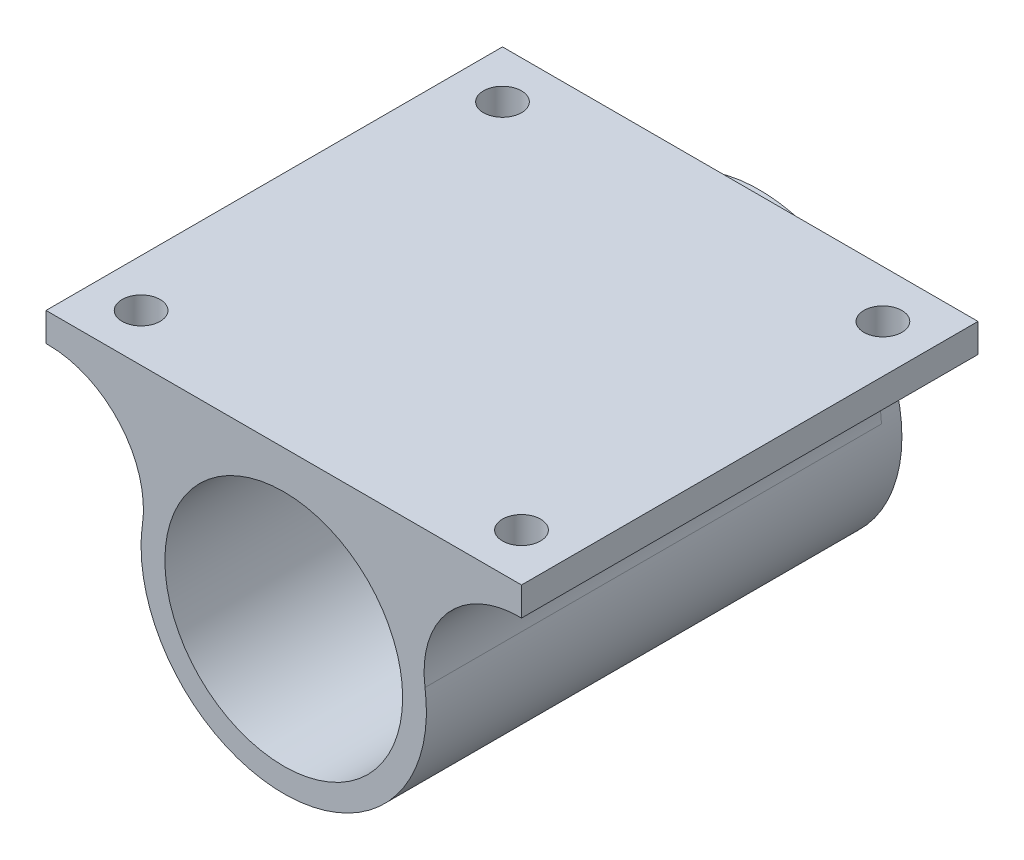
ISO-10303-21;
HEADER;
FILE_DESCRIPTION(('STEP AP214'),'2;1');
FILE_NAME('part.step','',(''),(''),'','','');
FILE_SCHEMA(('AUTOMOTIVE_DESIGN { 1 0 10303 214 1 1 1 1 }'));
ENDSEC;
DATA;
#1=APPLICATION_CONTEXT('core data for automotive mechanical design processes');
#2=APPLICATION_PROTOCOL_DEFINITION('international standard','automotive_design',2000,#1);
#3=PRODUCT_CONTEXT('',#1,'mechanical');
#4=PRODUCT('Part','Part','',(#3));
#5=PRODUCT_RELATED_PRODUCT_CATEGORY('part','',(#4));
#6=PRODUCT_DEFINITION_FORMATION('','',#4);
#7=PRODUCT_DEFINITION_CONTEXT('part definition',#1,'design');
#8=PRODUCT_DEFINITION('design','',#6,#7);
#9=PRODUCT_DEFINITION_SHAPE('','',#8);
#10=(LENGTH_UNIT() NAMED_UNIT(*) SI_UNIT(.MILLI.,.METRE.));
#11=(NAMED_UNIT(*) PLANE_ANGLE_UNIT() SI_UNIT($,.RADIAN.));
#12=(NAMED_UNIT(*) SI_UNIT($,.STERADIAN.) SOLID_ANGLE_UNIT());
#13=UNCERTAINTY_MEASURE_WITH_UNIT(LENGTH_MEASURE(1.E-05),#10,'distance_accuracy_value','');
#14=(GEOMETRIC_REPRESENTATION_CONTEXT(3) GLOBAL_UNCERTAINTY_ASSIGNED_CONTEXT((#13)) GLOBAL_UNIT_ASSIGNED_CONTEXT((#10,
#11,#12)) REPRESENTATION_CONTEXT('',''));
#15=CARTESIAN_POINT('',(0.,0.,0.));
#16=DIRECTION('',(0.,0.,1.));
#17=DIRECTION('',(1.,0.,0.));
#18=AXIS2_PLACEMENT_3D('',#15,#16,#17);
#19=CARTESIAN_POINT('',(-24.7549084540298,3.49206349206349,0.));
#20=DIRECTION('',(0.,0.,1.));
#21=DIRECTION('',(1.,0.,0.));
#22=AXIS2_PLACEMENT_3D('',#19,#20,#21);
#23=PLANE('',#22);
#24=CARTESIAN_POINT('',(0.,0.,0.));
#25=DIRECTION('',(0.,0.,-1.));
#26=DIRECTION('',(-1.,0.,0.));
#27=AXIS2_PLACEMENT_3D('',#24,#25,#26);
#28=CIRCLE('',#27,15.);
#29=CARTESIAN_POINT('',(-14.8529450724179,2.09523809523809,0.));
#30=VERTEX_POINT('',#29);
#31=CARTESIAN_POINT('',(14.8529450724179,2.0952380952381,0.));
#32=VERTEX_POINT('',#31);
#33=EDGE_CURVE('E136',#30,#32,#28,.T.);
#34=ORIENTED_EDGE('',*,*,#33,.F.);
#35=CARTESIAN_POINT('',(-24.7549084540298,3.49206349206349,0.));
#36=DIRECTION('',(0.,0.,-1.));
#37=DIRECTION('',(1.,0.,0.));
#38=AXIS2_PLACEMENT_3D('',#35,#36,#37);
#39=CIRCLE('',#38,10.);
#40=CARTESIAN_POINT('',(-24.7549084540298,13.4920634920635,0.));
#41=VERTEX_POINT('',#40);
#42=EDGE_CURVE('E163',#41,#30,#39,.T.);
#43=ORIENTED_EDGE('',*,*,#42,.F.);
#44=DIRECTION('',(1.,0.,0.));
#45=VECTOR('',#44,1.);
#46=CARTESIAN_POINT('',(-25.,13.4920634920635,0.));
#47=LINE('',#46,#45);
#48=CARTESIAN_POINT('',(-25.,13.4920634920635,0.));
#49=VERTEX_POINT('',#48);
#50=EDGE_CURVE('E160',#49,#41,#47,.T.);
#51=ORIENTED_EDGE('',*,*,#50,.F.);
#52=DIRECTION('',(0.,-1.,0.));
#53=VECTOR('',#52,1.);
#54=CARTESIAN_POINT('',(-25.,13.4920634920635,0.));
#55=LINE('',#54,#53);
#56=CARTESIAN_POINT('',(-25.,16.5079365079365,0.));
#57=VERTEX_POINT('',#56);
#58=EDGE_CURVE('E157',#57,#49,#55,.T.);
#59=ORIENTED_EDGE('',*,*,#58,.F.);
#60=DIRECTION('',(-1.,0.,0.));
#61=VECTOR('',#60,1.);
#62=CARTESIAN_POINT('',(-25.,16.5079365079365,0.));
#63=LINE('',#62,#61);
#64=CARTESIAN_POINT('',(25.,16.5079365079365,0.));
#65=VERTEX_POINT('',#64);
#66=EDGE_CURVE('E153',#65,#57,#63,.T.);
#67=ORIENTED_EDGE('',*,*,#66,.F.);
#68=DIRECTION('',(0.,1.,0.));
#69=VECTOR('',#68,1.);
#70=CARTESIAN_POINT('',(25.,13.4920634920635,0.));
#71=LINE('',#70,#69);
#72=CARTESIAN_POINT('',(25.,13.4920634920635,0.));
#73=VERTEX_POINT('',#72);
#74=EDGE_CURVE('E149',#73,#65,#71,.T.);
#75=ORIENTED_EDGE('',*,*,#74,.F.);
#76=DIRECTION('',(1.,0.,0.));
#77=VECTOR('',#76,1.);
#78=CARTESIAN_POINT('',(24.7549084540298,13.4920634920635,0.));
#79=LINE('',#78,#77);
#80=CARTESIAN_POINT('',(24.7549084540298,13.4920634920635,0.));
#81=VERTEX_POINT('',#80);
#82=EDGE_CURVE('E97',#81,#73,#79,.T.);
#83=ORIENTED_EDGE('',*,*,#82,.F.);
#84=CARTESIAN_POINT('',(24.7549084540298,3.49206349206349,0.));
#85=DIRECTION('',(0.,0.,-1.));
#86=DIRECTION('',(1.,0.,0.));
#87=AXIS2_PLACEMENT_3D('',#84,#85,#86);
#88=CIRCLE('',#87,10.);
#89=EDGE_CURVE('E91',#32,#81,#88,.T.);
#90=ORIENTED_EDGE('',*,*,#89,.F.);
#91=EDGE_LOOP('',(#34,#43,#51,#59,#67,#75,#83,#90));
#92=FACE_BOUND('',#91,.T.);
#93=ADVANCED_FACE('F39',(#92),#23,.F.);
#94=CARTESIAN_POINT('',(-24.7549084540298,3.49206349206349,48.));
#95=DIRECTION('',(0.,0.,1.));
#96=DIRECTION('',(1.,0.,0.));
#97=AXIS2_PLACEMENT_3D('',#94,#95,#96);
#98=PLANE('',#97);
#99=DIRECTION('',(0.,1.,0.));
#100=VECTOR('',#99,1.);
#101=CARTESIAN_POINT('',(25.,13.4920634920635,48.));
#102=LINE('',#101,#100);
#103=CARTESIAN_POINT('',(25.,13.4920634920635,48.));
#104=VERTEX_POINT('',#103);
#105=CARTESIAN_POINT('',(25.,16.5079365079365,48.));
#106=VERTEX_POINT('',#105);
#107=EDGE_CURVE('E171',#104,#106,#102,.T.);
#108=ORIENTED_EDGE('',*,*,#107,.T.);
#109=DIRECTION('',(-1.,0.,0.));
#110=VECTOR('',#109,1.);
#111=CARTESIAN_POINT('',(-25.,16.5079365079365,48.));
#112=LINE('',#111,#110);
#113=CARTESIAN_POINT('',(-25.,16.5079365079365,48.));
#114=VERTEX_POINT('',#113);
#115=EDGE_CURVE('E105',#106,#114,#112,.T.);
#116=ORIENTED_EDGE('',*,*,#115,.T.);
#117=DIRECTION('',(0.,-1.,0.));
#118=VECTOR('',#117,1.);
#119=CARTESIAN_POINT('',(-25.,13.4920634920635,48.));
#120=LINE('',#119,#118);
#121=CARTESIAN_POINT('',(-25.,13.4920634920635,48.));
#122=VERTEX_POINT('',#121);
#123=EDGE_CURVE('E325',#114,#122,#120,.T.);
#124=ORIENTED_EDGE('',*,*,#123,.T.);
#125=DIRECTION('',(1.,0.,0.));
#126=VECTOR('',#125,1.);
#127=CARTESIAN_POINT('',(-25.,13.4920634920635,48.));
#128=LINE('',#127,#126);
#129=CARTESIAN_POINT('',(-24.7549084540298,13.4920634920635,48.));
#130=VERTEX_POINT('',#129);
#131=EDGE_CURVE('E328',#122,#130,#128,.T.);
#132=ORIENTED_EDGE('',*,*,#131,.T.);
#133=CARTESIAN_POINT('',(-24.7549084540298,3.49206349206349,48.));
#134=DIRECTION('',(0.,0.,-1.));
#135=DIRECTION('',(1.,0.,0.));
#136=AXIS2_PLACEMENT_3D('',#133,#134,#135);
#137=CIRCLE('',#136,10.);
#138=CARTESIAN_POINT('',(-14.8529450724179,2.09523809523809,48.));
#139=VERTEX_POINT('',#138);
#140=EDGE_CURVE('E126',#130,#139,#137,.T.);
#141=ORIENTED_EDGE('',*,*,#140,.T.);
#142=CARTESIAN_POINT('',(0.,0.,48.));
#143=DIRECTION('',(0.,0.,1.));
#144=DIRECTION('',(1.,0.,0.));
#145=AXIS2_PLACEMENT_3D('',#142,#143,#144);
#146=CIRCLE('',#145,15.);
#147=CARTESIAN_POINT('',(14.8529450724179,2.0952380952381,48.));
#148=VERTEX_POINT('',#147);
#149=EDGE_CURVE('E119',#139,#148,#146,.T.);
#150=ORIENTED_EDGE('',*,*,#149,.T.);
#151=CARTESIAN_POINT('',(24.7549084540298,3.49206349206349,48.));
#152=DIRECTION('',(0.,0.,-1.));
#153=DIRECTION('',(1.,0.,0.));
#154=AXIS2_PLACEMENT_3D('',#151,#152,#153);
#155=CIRCLE('',#154,10.);
#156=CARTESIAN_POINT('',(24.7549084540298,13.4920634920635,48.));
#157=VERTEX_POINT('',#156);
#158=EDGE_CURVE('E124',#148,#157,#155,.T.);
#159=ORIENTED_EDGE('',*,*,#158,.T.);
#160=DIRECTION('',(1.,0.,0.));
#161=VECTOR('',#160,1.);
#162=CARTESIAN_POINT('',(24.7549084540298,13.4920634920635,48.));
#163=LINE('',#162,#161);
#164=EDGE_CURVE('E64',#157,#104,#163,.T.);
#165=ORIENTED_EDGE('',*,*,#164,.T.);
#166=EDGE_LOOP('',(#108,#116,#124,#132,#141,#150,#159,#165));
#167=FACE_BOUND('',#166,.T.);
#168=CARTESIAN_POINT('',(0.,0.,48.));
#169=DIRECTION('',(0.,0.,1.));
#170=DIRECTION('',(1.,0.,0.));
#171=AXIS2_PLACEMENT_3D('',#168,#169,#170);
#172=CIRCLE('',#171,12.5);
#173=CARTESIAN_POINT('',(12.5,0.,48.));
#174=VERTEX_POINT('',#173);
#175=EDGE_CURVE('E154',#174,#174,#172,.T.);
#176=ORIENTED_EDGE('',*,*,#175,.F.);
#177=EDGE_LOOP('',(#176));
#178=FACE_BOUND('',#177,.T.);
#179=ADVANCED_FACE('F121',(#167,#178),#98,.T.);
#180=CARTESIAN_POINT('',(25.,13.4920634920635,48.));
#181=DIRECTION('',(-1.,0.,0.));
#182=DIRECTION('',(0.,0.,1.));
#183=AXIS2_PLACEMENT_3D('',#180,#181,#182);
#184=PLANE('',#183);
#185=ORIENTED_EDGE('',*,*,#74,.T.);
#186=DIRECTION('',(0.,0.,-1.));
#187=VECTOR('',#186,1.);
#188=CARTESIAN_POINT('',(25.,16.5079365079365,48.));
#189=LINE('',#188,#187);
#190=EDGE_CURVE('E11',#106,#65,#189,.T.);
#191=ORIENTED_EDGE('',*,*,#190,.F.);
#192=ORIENTED_EDGE('',*,*,#107,.F.);
#193=DIRECTION('',(0.,0.,-1.));
#194=VECTOR('',#193,1.);
#195=CARTESIAN_POINT('',(25.,13.4920634920635,48.));
#196=LINE('',#195,#194);
#197=EDGE_CURVE('E145',#104,#73,#196,.T.);
#198=ORIENTED_EDGE('',*,*,#197,.T.);
#199=EDGE_LOOP('',(#185,#191,#192,#198));
#200=FACE_BOUND('',#199,.T.);
#201=ADVANCED_FACE('F41',(#200),#184,.F.);
#202=CARTESIAN_POINT('',(-25.,16.5079365079365,48.));
#203=DIRECTION('',(0.,-1.,0.));
#204=DIRECTION('',(0.,0.,-1.));
#205=AXIS2_PLACEMENT_3D('',#202,#203,#204);
#206=PLANE('',#205);
#207=CARTESIAN_POINT('',(-20.,16.5079365079365,43.));
#208=DIRECTION('',(0.,1.,0.));
#209=DIRECTION('',(0.,0.,1.));
#210=AXIS2_PLACEMENT_3D('',#207,#208,#209);
#211=CIRCLE('',#210,2.00000000000001);
#212=CARTESIAN_POINT('',(-20.,16.5079365079365,45.));
#213=VERTEX_POINT('',#212);
#214=EDGE_CURVE('E295',#213,#213,#211,.T.);
#215=ORIENTED_EDGE('',*,*,#214,.F.);
#216=EDGE_LOOP('',(#215));
#217=FACE_BOUND('',#216,.T.);
#218=CARTESIAN_POINT('',(20.,16.5079365079365,43.));
#219=DIRECTION('',(0.,1.,0.));
#220=DIRECTION('',(0.,0.,1.));
#221=AXIS2_PLACEMENT_3D('',#218,#219,#220);
#222=CIRCLE('',#221,2.00000000000001);
#223=CARTESIAN_POINT('',(20.,16.5079365079365,45.));
#224=VERTEX_POINT('',#223);
#225=EDGE_CURVE('E291',#224,#224,#222,.T.);
#226=ORIENTED_EDGE('',*,*,#225,.F.);
#227=EDGE_LOOP('',(#226));
#228=FACE_BOUND('',#227,.T.);
#229=CARTESIAN_POINT('',(20.,16.5079365079365,5.));
#230=DIRECTION('',(0.,1.,0.));
#231=DIRECTION('',(0.,0.,1.));
#232=AXIS2_PLACEMENT_3D('',#229,#230,#231);
#233=CIRCLE('',#232,2.);
#234=CARTESIAN_POINT('',(20.,16.5079365079365,7.));
#235=VERTEX_POINT('',#234);
#236=EDGE_CURVE('E287',#235,#235,#233,.T.);
#237=ORIENTED_EDGE('',*,*,#236,.F.);
#238=EDGE_LOOP('',(#237));
#239=FACE_BOUND('',#238,.T.);
#240=CARTESIAN_POINT('',(-20.,16.5079365079365,5.));
#241=DIRECTION('',(0.,1.,0.));
#242=DIRECTION('',(0.,0.,1.));
#243=AXIS2_PLACEMENT_3D('',#240,#241,#242);
#244=CIRCLE('',#243,2.);
#245=CARTESIAN_POINT('',(-20.,16.5079365079365,7.));
#246=VERTEX_POINT('',#245);
#247=EDGE_CURVE('E199',#246,#246,#244,.T.);
#248=ORIENTED_EDGE('',*,*,#247,.F.);
#249=EDGE_LOOP('',(#248));
#250=FACE_BOUND('',#249,.T.);
#251=ORIENTED_EDGE('',*,*,#66,.T.);
#252=DIRECTION('',(0.,0.,-1.));
#253=VECTOR('',#252,1.);
#254=CARTESIAN_POINT('',(-25.,16.5079365079365,48.));
#255=LINE('',#254,#253);
#256=EDGE_CURVE('E55',#114,#57,#255,.T.);
#257=ORIENTED_EDGE('',*,*,#256,.F.);
#258=ORIENTED_EDGE('',*,*,#115,.F.);
#259=ORIENTED_EDGE('',*,*,#190,.T.);
#260=EDGE_LOOP('',(#251,#257,#258,#259));
#261=FACE_BOUND('',#260,.T.);
#262=ADVANCED_FACE('F245',(#217,#228,#239,#250,#261),#206,.F.);
#263=CARTESIAN_POINT('',(-25.,13.4920634920635,48.));
#264=DIRECTION('',(1.,0.,0.));
#265=DIRECTION('',(0.,0.,-1.));
#266=AXIS2_PLACEMENT_3D('',#263,#264,#265);
#267=PLANE('',#266);
#268=ORIENTED_EDGE('',*,*,#58,.T.);
#269=DIRECTION('',(0.,0.,-1.));
#270=VECTOR('',#269,1.);
#271=CARTESIAN_POINT('',(-25.,13.4920634920635,48.));
#272=LINE('',#271,#270);
#273=EDGE_CURVE('E182',#122,#49,#272,.T.);
#274=ORIENTED_EDGE('',*,*,#273,.F.);
#275=ORIENTED_EDGE('',*,*,#123,.F.);
#276=ORIENTED_EDGE('',*,*,#256,.T.);
#277=EDGE_LOOP('',(#268,#274,#275,#276));
#278=FACE_BOUND('',#277,.T.);
#279=ADVANCED_FACE('F242',(#278),#267,.F.);
#280=CARTESIAN_POINT('',(-25.,13.4920634920635,48.));
#281=DIRECTION('',(0.,1.,0.));
#282=DIRECTION('',(0.,0.,1.));
#283=AXIS2_PLACEMENT_3D('',#280,#281,#282);
#284=PLANE('',#283);
#285=ORIENTED_EDGE('',*,*,#50,.T.);
#286=DIRECTION('',(0.,0.,-1.));
#287=VECTOR('',#286,1.);
#288=CARTESIAN_POINT('',(-24.7549084540298,13.4920634920635,48.));
#289=LINE('',#288,#287);
#290=EDGE_CURVE('E178',#130,#41,#289,.T.);
#291=ORIENTED_EDGE('',*,*,#290,.F.);
#292=ORIENTED_EDGE('',*,*,#131,.F.);
#293=ORIENTED_EDGE('',*,*,#273,.T.);
#294=EDGE_LOOP('',(#285,#291,#292,#293));
#295=FACE_BOUND('',#294,.T.);
#296=ADVANCED_FACE('F237',(#295),#284,.F.);
#297=CARTESIAN_POINT('',(-24.7549084540298,3.49206349206349,48.));
#298=DIRECTION('',(0.,0.,-1.));
#299=DIRECTION('',(-1.,0.,0.));
#300=AXIS2_PLACEMENT_3D('',#297,#298,#299);
#301=CYLINDRICAL_SURFACE('',#300,10.);
#302=CARTESIAN_POINT('',(-20.,12.289270184747,45.));
#303=CARTESIAN_POINT('',(-19.8499290972235,12.2081465541984,44.9999937182735));
#304=CARTESIAN_POINT('',(-19.7017807725336,12.1230485363312,44.983072587102));
#305=CARTESIAN_POINT('',(-19.4148197809947,11.9485315853793,44.9181587551048));
#306=CARTESIAN_POINT('',(-19.2760357298449,11.8591007261735,44.870075189037));
#307=CARTESIAN_POINT('',(-19.0290015306966,11.6916588398037,44.7531067433536));
#308=CARTESIAN_POINT('',(-18.9191140499962,11.6136447296544,44.6876531770342));
#309=CARTESIAN_POINT('',(-18.7124004190283,11.4610363583639,44.5357419839876));
#310=CARTESIAN_POINT('',(-18.6155520394312,11.3864364237843,44.4493208267485));
#311=CARTESIAN_POINT('',(-18.4577674633812,11.2608366884655,44.2774710944053));
#312=CARTESIAN_POINT('',(-18.3936368115319,11.2082808957585,44.1961073683822));
#313=CARTESIAN_POINT('',(-18.2771863842114,11.1107813834324,44.0212292991033));
#314=CARTESIAN_POINT('',(-18.2248501851074,11.0658271008698,43.9277321411924));
#315=CARTESIAN_POINT('',(-18.1437769236227,10.9950789353472,43.7496510967917));
#316=CARTESIAN_POINT('',(-18.1124082520277,10.9672489215657,43.6670830802674));
#317=CARTESIAN_POINT('',(-18.0604646402178,10.9207676322527,43.4961443845373));
#318=CARTESIAN_POINT('',(-18.0398803757487,10.9021084284583,43.4077787925856));
#319=CARTESIAN_POINT('',(-18.0107848269262,10.8756400052399,43.2268509152493));
#320=CARTESIAN_POINT('',(-18.0023508263381,10.8679002471397,43.1342655962713));
#321=CARTESIAN_POINT('',(-17.9985076854011,10.8643806229522,42.948603943706));
#322=CARTESIAN_POINT('',(-18.0030950550684,10.8685975522368,42.8555277483574));
#323=CARTESIAN_POINT('',(-18.0238043988184,10.8874942062405,42.6812749507699));
#324=CARTESIAN_POINT('',(-18.0387404753481,10.9010976821524,42.5998320101432));
#325=CARTESIAN_POINT('',(-18.07794057054,10.9364434473818,42.4410882699368));
#326=CARTESIAN_POINT('',(-18.1022089076774,10.9581895045314,42.3637894069132));
#327=CARTESIAN_POINT('',(-18.1683404048472,11.016665979366,42.1898726579217));
#328=CARTESIAN_POINT('',(-18.2133684494546,11.0559736472139,42.0953262355344));
#329=CARTESIAN_POINT('',(-18.3153595332875,11.1429924862974,41.9171449614975));
#330=CARTESIAN_POINT('',(-18.372346150132,11.1907202285572,41.8335322033715));
#331=CARTESIAN_POINT('',(-18.5131764869047,11.3055844569505,41.6563330536844));
#332=CARTESIAN_POINT('',(-18.6000975170406,11.3744508004822,41.5663173067458));
#333=CARTESIAN_POINT('',(-18.7867440194917,11.5167019328239,41.4052502826701));
#334=CARTESIAN_POINT('',(-18.8864771025463,11.5900893937162,41.3342103555998));
#335=CARTESIAN_POINT('',(-19.0976047245287,11.7389888815935,41.2109270530283));
#336=CARTESIAN_POINT('',(-19.2091186938296,11.8145155645727,41.1589059977585));
#337=CARTESIAN_POINT('',(-19.4405915550631,11.9641963609993,41.0758957884659));
#338=CARTESIAN_POINT('',(-19.5605504205059,12.0383504787511,41.0449065684737));
#339=CARTESIAN_POINT('',(-19.8143871652168,12.1877109243319,41.0042249935073));
#340=CARTESIAN_POINT('',(-19.9486625596003,12.2626703514287,40.9960537321987));
#341=CARTESIAN_POINT('',(-20.2196947777307,12.4058320283954,41.007490858372));
#342=CARTESIAN_POINT('',(-20.356450400059,12.4740374516444,41.0270861328094));
#343=CARTESIAN_POINT('',(-20.6144039692542,12.5956168645207,41.092500860335));
#344=CARTESIAN_POINT('',(-20.7358780093424,12.6497775064236,41.1357489590052));
#345=CARTESIAN_POINT('',(-20.9709772148919,12.7493919442223,41.2467041729331));
#346=CARTESIAN_POINT('',(-21.0846099973076,12.7948542679612,41.3143871422612));
#347=CARTESIAN_POINT('',(-21.2850784776492,12.8713162066646,41.4630608795286));
#348=CARTESIAN_POINT('',(-21.3734902938397,12.9034089805857,41.5413719350524));
#349=CARTESIAN_POINT('',(-21.5361315447771,12.9602684505525,41.7137964165835));
#350=CARTESIAN_POINT('',(-21.6103676529551,12.9850385968625,41.8079023675023));
#351=CARTESIAN_POINT('',(-21.7362972245659,13.0257954426585,42.0012262717278));
#352=CARTESIAN_POINT('',(-21.7892872281884,13.0423120090011,42.0994910528258));
#353=CARTESIAN_POINT('',(-21.8783612224339,13.0695191691687,42.3041522056295));
#354=CARTESIAN_POINT('',(-21.9144487041706,13.0802109661391,42.4105468928673));
#355=CARTESIAN_POINT('',(-21.967534254824,13.0957758927102,42.6249743210886));
#356=CARTESIAN_POINT('',(-21.9850743501209,13.1008145172979,42.7328612998689));
#357=CARTESIAN_POINT('',(-22.0023469504448,13.1057771052013,42.9501665055044));
#358=CARTESIAN_POINT('',(-22.0020805889293,13.1057013940665,43.059584634452));
#359=CARTESIAN_POINT('',(-21.9838230074294,13.1004541457028,43.2759347141134));
#360=CARTESIAN_POINT('',(-21.9659712998577,13.0953227176824,43.3828794540852));
#361=CARTESIAN_POINT('',(-21.913376988255,13.0798913419215,43.5921368840226));
#362=CARTESIAN_POINT('',(-21.8786348654894,13.0695915414453,43.6944497058764));
#363=CARTESIAN_POINT('',(-21.793407709572,13.0435811794716,43.8917732810026));
#364=CARTESIAN_POINT('',(-21.7428939955222,13.0278607549999,43.9867703348908));
#365=CARTESIAN_POINT('',(-21.6279507709431,12.9907880532486,44.1666932845774));
#366=CARTESIAN_POINT('',(-21.5635216958564,12.969435952192,44.2516194953862));
#367=CARTESIAN_POINT('',(-21.4220473426773,12.9206210636967,44.4104059875398));
#368=CARTESIAN_POINT('',(-21.3448390174077,12.893077396748,44.4840958822341));
#369=CARTESIAN_POINT('',(-21.1811629670766,12.8320828863964,44.6174060085193));
#370=CARTESIAN_POINT('',(-21.0946924417713,12.7986302545391,44.6770219675801));
#371=CARTESIAN_POINT('',(-20.91171832166,12.7246151230315,44.7833730609601));
#372=CARTESIAN_POINT('',(-20.8149501622924,12.6838194593592,44.8294883944));
#373=CARTESIAN_POINT('',(-20.6176144964297,12.5967005059534,44.905181404412));
#374=CARTESIAN_POINT('',(-20.5170490798819,12.5503802274231,44.9347680404509));
#375=CARTESIAN_POINT('',(-20.3466635775559,12.468327556709,44.9710030870683));
#376=CARTESIAN_POINT('',(-20.2771136115242,12.4338425884058,44.9819381573258));
#377=CARTESIAN_POINT('',(-20.1382405902201,12.3629413589008,44.9964385077813));
#378=CARTESIAN_POINT('',(-20.0689175637957,12.3265248615713,45.0000028847784));
#379=CARTESIAN_POINT('',(-20.,12.289270184747,45.));
#380=B_SPLINE_CURVE_WITH_KNOTS('',3,(#302,#303,#304,#305,#306,#307,#308,#309,#310,#311,#312,
#313,#314,#315,#316,#317,#318,#319,#320,#321,#322,#323,#324,#325,#326,#327,#328,#329,#330,#331,
#332,#333,#334,#335,#336,#337,#338,#339,#340,#341,#342,#343,#344,#345,#346,#347,#348,#349,#350,
#351,#352,#353,#354,#355,#356,#357,#358,#359,#360,#361,#362,#363,#364,#365,#366,#367,#368,#369,
#370,#371,#372,#373,#374,#375,#376,#377,#378,#379),.UNSPECIFIED.,.T.,.F.,(4,2,2,2,2,2,2,2,2,2,2,
2,2,2,2,2,2,2,2,2,2,2,2,2,2,2,2,2,2,2,2,2,2,2,2,2,2,2,4),(0.,0.51140488439519,1.0243077031139,
1.47185439570264,1.9186281696996,2.26590763114683,2.61270048030028,2.88942564163808,
3.16591114847282,3.44414763827785,3.72230956226185,3.97295556768324,4.22371769862332,
4.55745941267159,4.89186542305979,5.31814183442911,5.74467264778895,6.17604098759822,
6.6074079743542,7.06691373593841,7.52620256330301,7.94334653066246,8.36007941002507,
8.72529191893769,9.09033207231545,9.42723446749168,9.76406724679863,10.0907587575675,
10.4174294730376,10.7415292664118,11.0656198256213,11.3903032156917,11.7149764471664,
12.0441665447998,12.3734564489988,12.7160889604074,13.0585355654131,13.2933609712875,
13.5282151508367),.UNSPECIFIED.);
#381=CARTESIAN_POINT('',(-20.,12.289270184747,45.));
#382=VERTEX_POINT('',#381);
#383=EDGE_CURVE('E43',#382,#382,#380,.T.);
#384=ORIENTED_EDGE('',*,*,#383,.T.);
#385=EDGE_LOOP('',(#384));
#386=FACE_BOUND('',#385,.T.);
#387=CARTESIAN_POINT('',(-20.,12.289270184747,7.));
#388=CARTESIAN_POINT('',(-19.8499290972235,12.2081465541984,6.99999371827345));
#389=CARTESIAN_POINT('',(-19.7017807725336,12.1230485363312,6.98307258710202));
#390=CARTESIAN_POINT('',(-19.4148197809947,11.9485315853793,6.91815875510483));
#391=CARTESIAN_POINT('',(-19.2760357298449,11.8591007261735,6.87007518903703));
#392=CARTESIAN_POINT('',(-19.0290015306966,11.6916588398037,6.75310674335357));
#393=CARTESIAN_POINT('',(-18.9191140499962,11.6136447296544,6.68765317703424));
#394=CARTESIAN_POINT('',(-18.7124004190283,11.4610363583639,6.53574198398759));
#395=CARTESIAN_POINT('',(-18.6155520394312,11.3864364237843,6.44932082674846));
#396=CARTESIAN_POINT('',(-18.4577674633812,11.2608366884655,6.27747109440528));
#397=CARTESIAN_POINT('',(-18.3936368115319,11.2082808957585,6.19610736838222));
#398=CARTESIAN_POINT('',(-18.2771863842114,11.1107813834324,6.02122929910326));
#399=CARTESIAN_POINT('',(-18.2248501851074,11.0658271008698,5.92773214119234));
#400=CARTESIAN_POINT('',(-18.1437769236227,10.9950789353472,5.74965109679169));
#401=CARTESIAN_POINT('',(-18.1124082520277,10.9672489215657,5.66708308026741));
#402=CARTESIAN_POINT('',(-18.0604646402178,10.9207676322527,5.49614438453728));
#403=CARTESIAN_POINT('',(-18.0398803757487,10.9021084284583,5.40777879258557));
#404=CARTESIAN_POINT('',(-18.0107848269262,10.8756400052399,5.22685091524926));
#405=CARTESIAN_POINT('',(-18.0023508263381,10.8679002471397,5.13426559627128));
#406=CARTESIAN_POINT('',(-17.9985076854011,10.8643806229522,4.94860394370596));
#407=CARTESIAN_POINT('',(-18.0030950550684,10.8685975522368,4.85552774835734));
#408=CARTESIAN_POINT('',(-18.0238043988184,10.8874942062405,4.68127495076987));
#409=CARTESIAN_POINT('',(-18.0387404753481,10.9010976821524,4.59983201014321));
#410=CARTESIAN_POINT('',(-18.07794057054,10.9364434473818,4.44108826993684));
#411=CARTESIAN_POINT('',(-18.1022089076774,10.9581895045314,4.36378940691315));
#412=CARTESIAN_POINT('',(-18.1683404048472,11.016665979366,4.18987265792173));
#413=CARTESIAN_POINT('',(-18.2133684494546,11.0559736472139,4.09532623553435));
#414=CARTESIAN_POINT('',(-18.3153595332875,11.1429924862974,3.91714496149748));
#415=CARTESIAN_POINT('',(-18.372346150132,11.1907202285572,3.83353220337151));
#416=CARTESIAN_POINT('',(-18.5131764869047,11.3055844569505,3.65633305368438));
#417=CARTESIAN_POINT('',(-18.6000975170406,11.3744508004822,3.56631730674577));
#418=CARTESIAN_POINT('',(-18.7867440194918,11.5167019328239,3.40525028267013));
#419=CARTESIAN_POINT('',(-18.8864771025463,11.5900893937162,3.33421035559981));
#420=CARTESIAN_POINT('',(-19.0976047245287,11.7389888815935,3.21092705302827));
#421=CARTESIAN_POINT('',(-19.2091186938296,11.8145155645727,3.15890599775848));
#422=CARTESIAN_POINT('',(-19.4405915550632,11.9641963609993,3.07589578846586));
#423=CARTESIAN_POINT('',(-19.5605504205059,12.0383504787511,3.04490656847374));
#424=CARTESIAN_POINT('',(-19.8143871652169,12.1877109243319,3.0042249935073));
#425=CARTESIAN_POINT('',(-19.9486625596003,12.2626703514287,2.99605373219867));
#426=CARTESIAN_POINT('',(-20.2196947777308,12.4058320283954,3.00749085837204));
#427=CARTESIAN_POINT('',(-20.356450400059,12.4740374516445,3.02708613280939));
#428=CARTESIAN_POINT('',(-20.6144039692542,12.5956168645207,3.09250086033496));
#429=CARTESIAN_POINT('',(-20.7358780093424,12.6497775064236,3.13574895900522));
#430=CARTESIAN_POINT('',(-20.9709772148919,12.7493919442223,3.24670417293306));
#431=CARTESIAN_POINT('',(-21.0846099973076,12.7948542679612,3.31438714226119));
#432=CARTESIAN_POINT('',(-21.2850784776492,12.8713162066646,3.46306087952866));
#433=CARTESIAN_POINT('',(-21.3734902938397,12.9034089805857,3.54137193505238));
#434=CARTESIAN_POINT('',(-21.5361315447771,12.9602684505525,3.71379641658346));
#435=CARTESIAN_POINT('',(-21.6103676529551,12.9850385968625,3.80790236750226));
#436=CARTESIAN_POINT('',(-21.7362972245659,13.0257954426585,4.00122627172779));
#437=CARTESIAN_POINT('',(-21.7892872281884,13.0423120090011,4.09949105282578));
#438=CARTESIAN_POINT('',(-21.8783612224339,13.0695191691687,4.3041522056295));
#439=CARTESIAN_POINT('',(-21.9144487041706,13.0802109661391,4.41054689286727));
#440=CARTESIAN_POINT('',(-21.9675342548239,13.0957758927102,4.62497432108864));
#441=CARTESIAN_POINT('',(-21.9850743501208,13.1008145172979,4.73286129986891));
#442=CARTESIAN_POINT('',(-22.0023469504448,13.1057771052013,4.95016650550438));
#443=CARTESIAN_POINT('',(-22.0020805889293,13.1057013940665,5.05958463445201));
#444=CARTESIAN_POINT('',(-21.9838230074294,13.1004541457028,5.27593471411339));
#445=CARTESIAN_POINT('',(-21.9659712998577,13.0953227176824,5.38287945408524));
#446=CARTESIAN_POINT('',(-21.913376988255,13.0798913419215,5.59213688402261));
#447=CARTESIAN_POINT('',(-21.8786348654894,13.0695915414453,5.69444970587643));
#448=CARTESIAN_POINT('',(-21.793407709572,13.0435811794716,5.89177328100263));
#449=CARTESIAN_POINT('',(-21.7428939955222,13.0278607549999,5.98677033489079));
#450=CARTESIAN_POINT('',(-21.6279507709431,12.9907880532486,6.16669328457738));
#451=CARTESIAN_POINT('',(-21.5635216958563,12.969435952192,6.25161949538616));
#452=CARTESIAN_POINT('',(-21.4220473426773,12.9206210636967,6.41040598753979));
#453=CARTESIAN_POINT('',(-21.3448390174076,12.893077396748,6.48409588223408));
#454=CARTESIAN_POINT('',(-21.1811629670766,12.8320828863964,6.61740600851931));
#455=CARTESIAN_POINT('',(-21.0946924417713,12.7986302545391,6.67702196758009));
#456=CARTESIAN_POINT('',(-20.91171832166,12.7246151230315,6.78337306096007));
#457=CARTESIAN_POINT('',(-20.8149501622924,12.6838194593592,6.82948839440002));
#458=CARTESIAN_POINT('',(-20.6176144964297,12.5967005059534,6.90518140441198));
#459=CARTESIAN_POINT('',(-20.5170490798819,12.5503802274231,6.93476804045094));
#460=CARTESIAN_POINT('',(-20.3466635775559,12.468327556709,6.97100308706831));
#461=CARTESIAN_POINT('',(-20.2771136115242,12.4338425884058,6.98193815732583));
#462=CARTESIAN_POINT('',(-20.1382405902201,12.3629413589008,6.99643850778125));
#463=CARTESIAN_POINT('',(-20.0689175637957,12.3265248615713,7.00000288477835));
#464=CARTESIAN_POINT('',(-20.,12.289270184747,7.));
#465=B_SPLINE_CURVE_WITH_KNOTS('',3,(#387,#388,#389,#390,#391,#392,#393,#394,#395,#396,#397,
#398,#399,#400,#401,#402,#403,#404,#405,#406,#407,#408,#409,#410,#411,#412,#413,#414,#415,#416,
#417,#418,#419,#420,#421,#422,#423,#424,#425,#426,#427,#428,#429,#430,#431,#432,#433,#434,#435,
#436,#437,#438,#439,#440,#441,#442,#443,#444,#445,#446,#447,#448,#449,#450,#451,#452,#453,#454,
#455,#456,#457,#458,#459,#460,#461,#462,#463,#464),.UNSPECIFIED.,.T.,.F.,(4,2,2,2,2,2,2,2,2,2,2,
2,2,2,2,2,2,2,2,2,2,2,2,2,2,2,2,2,2,2,2,2,2,2,2,2,2,2,4),(0.,0.511404884395189,1.0243077031139,
1.47185439570264,1.9186281696996,2.26590763114683,2.61270048030028,2.88942564163808,
3.16591114847283,3.44414763827787,3.72230956226185,3.97295556768324,4.22371769862332,
4.55745941267159,4.89186542305979,5.31814183442912,5.74467264778895,6.17604098759823,
6.6074079743542,7.06691373593843,7.52620256330301,7.94334653066247,8.36007941002508,
8.72529191893769,9.09033207231544,9.42723446749167,9.76406724679863,10.0907587575675,
10.4174294730376,10.7415292664118,11.0656198256213,11.3903032156917,11.7149764471664,
12.0441665447998,12.3734564489988,12.7160889604074,13.0585355654131,13.2933609712875,
13.5282151508366),.UNSPECIFIED.);
#466=CARTESIAN_POINT('',(-20.,12.289270184747,7.));
#467=VERTEX_POINT('',#466);
#468=EDGE_CURVE('E227',#467,#467,#465,.T.);
#469=ORIENTED_EDGE('',*,*,#468,.T.);
#470=EDGE_LOOP('',(#469));
#471=FACE_BOUND('',#470,.T.);
#472=ORIENTED_EDGE('',*,*,#42,.T.);
#473=DIRECTION('',(0.,0.,-1.));
#474=VECTOR('',#473,1.);
#475=CARTESIAN_POINT('',(-14.8529450724179,2.09523809523809,48.));
#476=LINE('',#475,#474);
#477=EDGE_CURVE('E138',#139,#30,#476,.T.);
#478=ORIENTED_EDGE('',*,*,#477,.F.);
#479=ORIENTED_EDGE('',*,*,#140,.F.);
#480=ORIENTED_EDGE('',*,*,#290,.T.);
#481=EDGE_LOOP('',(#472,#478,#479,#480));
#482=FACE_BOUND('',#481,.T.);
#483=ADVANCED_FACE('F233',(#386,#471,#482),#301,.F.);
#484=CARTESIAN_POINT('',(0.,0.,48.));
#485=DIRECTION('',(0.,0.,-1.));
#486=DIRECTION('',(-1.,0.,0.));
#487=AXIS2_PLACEMENT_3D('',#484,#485,#486);
#488=CYLINDRICAL_SURFACE('',#487,15.);
#489=ORIENTED_EDGE('',*,*,#477,.T.);
#490=ORIENTED_EDGE('',*,*,#33,.T.);
#491=DIRECTION('',(0.,0.,-1.));
#492=VECTOR('',#491,1.);
#493=CARTESIAN_POINT('',(14.8529450724179,2.0952380952381,48.));
#494=LINE('',#493,#492);
#495=EDGE_CURVE('E132',#148,#32,#494,.T.);
#496=ORIENTED_EDGE('',*,*,#495,.F.);
#497=ORIENTED_EDGE('',*,*,#149,.F.);
#498=EDGE_LOOP('',(#489,#490,#496,#497));
#499=FACE_BOUND('',#498,.T.);
#500=CARTESIAN_POINT('',(0.,0.,-2.));
#501=DIRECTION('',(0.,0.,-1.));
#502=DIRECTION('',(-1.,0.,0.));
#503=AXIS2_PLACEMENT_3D('',#500,#501,#502);
#504=CIRCLE('',#503,15.);
#505=CARTESIAN_POINT('',(-15.,0.,-2.));
#506=VERTEX_POINT('',#505);
#507=EDGE_CURVE('E308',#506,#506,#504,.T.);
#508=ORIENTED_EDGE('',*,*,#507,.F.);
#509=EDGE_LOOP('',(#508));
#510=FACE_BOUND('',#509,.T.);
#511=ADVANCED_FACE('F133',(#499,#510),#488,.T.);
#512=CARTESIAN_POINT('',(24.7549084540298,3.49206349206349,48.));
#513=DIRECTION('',(0.,0.,-1.));
#514=DIRECTION('',(-1.,0.,0.));
#515=AXIS2_PLACEMENT_3D('',#512,#513,#514);
#516=CYLINDRICAL_SURFACE('',#515,10.);
#517=CARTESIAN_POINT('',(20.,12.289270184747,45.));
#518=CARTESIAN_POINT('',(20.1139030398849,12.3508318700118,44.9999968697376));
#519=CARTESIAN_POINT('',(20.229163554164,12.4102476150077,44.9902477245302));
#520=CARTESIAN_POINT('',(20.459162546795,12.5232888313599,44.9500831295319));
#521=CARTESIAN_POINT('',(20.5738998531972,12.5769046082836,44.9196336802269));
#522=CARTESIAN_POINT('',(20.7993034346805,12.6772940492636,44.8372683470795));
#523=CARTESIAN_POINT('',(20.9099510775737,12.7240387416141,44.7852649109599));
#524=CARTESIAN_POINT('',(21.1220092335326,12.8095265284138,44.6601867772649));
#525=CARTESIAN_POINT('',(21.2234274585455,12.8482763382112,44.5871298883189));
#526=CARTESIAN_POINT('',(21.4040809752184,12.9143995873082,44.428880364877));
#527=CARTESIAN_POINT('',(21.4844803866651,12.9424713631474,44.345306687247));
#528=CARTESIAN_POINT('',(21.6303515941389,12.9916996267433,44.1642394350382));
#529=CARTESIAN_POINT('',(21.6958277640389,13.0128581415073,44.0667499527196));
#530=CARTESIAN_POINT('',(21.8054845681248,13.0473765324992,43.8673817072557));
#531=CARTESIAN_POINT('',(21.8507471871225,13.0611438396231,43.7661667126061));
#532=CARTESIAN_POINT('',(21.9240302611407,13.0830802844234,43.5571077178632));
#533=CARTESIAN_POINT('',(21.952053683747,13.0912503856404,43.4492648622192));
#534=CARTESIAN_POINT('',(21.9893804760445,13.1020700655413,43.2327199176));
#535=CARTESIAN_POINT('',(21.9991043932567,13.1048437141292,43.124096255033));
#536=CARTESIAN_POINT('',(22.0007770329323,13.1053231899834,42.9067027167231));
#537=CARTESIAN_POINT('',(21.9927266678666,13.1030292774011,42.7979328487723));
#538=CARTESIAN_POINT('',(21.959223176608,13.0933363522629,42.5839306440191));
#539=CARTESIAN_POINT('',(21.9338614278963,13.0859641434347,42.4786827617793));
#540=CARTESIAN_POINT('',(21.8667224090565,13.0659654732545,42.274095325997));
#541=CARTESIAN_POINT('',(21.8249455965183,13.0533391583664,42.174755607846));
#542=CARTESIAN_POINT('',(21.726267776128,13.02254111991,41.9843522870505));
#543=CARTESIAN_POINT('',(21.6693099837996,13.0043485371046,41.8933215167526));
#544=CARTESIAN_POINT('',(21.5423837304557,12.9622346699963,41.7223497546604));
#545=CARTESIAN_POINT('',(21.4724150328424,12.9383132815153,41.6424089645787));
#546=CARTESIAN_POINT('',(21.3205486562855,12.8841757427624,41.4941390100386));
#547=CARTESIAN_POINT('',(21.2384565496626,12.8538526643753,41.4260484259878));
#548=CARTESIAN_POINT('',(21.066184222316,12.7873222335354,41.3046044043895));
#549=CARTESIAN_POINT('',(20.976002732158,12.7511139568159,41.2512532852247));
#550=CARTESIAN_POINT('',(20.7859501615493,12.6713053895277,41.1577097064473));
#551=CARTESIAN_POINT('',(20.6858215834767,12.6274330314321,41.118274939809));
#552=CARTESIAN_POINT('',(20.4828981836598,12.5343202690628,41.0562716076678));
#553=CARTESIAN_POINT('',(20.38010240617,12.4850779197206,41.0337091769117));
#554=CARTESIAN_POINT('',(20.1652359486544,12.3774781997537,41.0036284374324));
#555=CARTESIAN_POINT('',(20.0531628877243,12.3186993480699,40.9976462641851));
#556=CARTESIAN_POINT('',(19.8317666362274,12.1971572388792,41.0040092284436));
#557=CARTESIAN_POINT('',(19.7224444446322,12.1343925622732,41.0163609288932));
#558=CARTESIAN_POINT('',(19.4960763390451,11.9987703978094,41.0606994305091));
#559=CARTESIAN_POINT('',(19.379639321927,11.9255953962924,41.0948294241483));
#560=CARTESIAN_POINT('',(19.1551578235787,11.7782487297321,41.1831844605348));
#561=CARTESIAN_POINT('',(19.0471240489838,11.7040759300075,41.2374346471822));
#562=CARTESIAN_POINT('',(18.8328081223346,11.5510650438744,41.3706006795597));
#563=CARTESIAN_POINT('',(18.7274831935803,11.4723773402906,41.4512422248078));
#564=CARTESIAN_POINT('',(18.5325774943036,11.3213502940167,41.6345284267934));
#565=CARTESIAN_POINT('',(18.4429712803006,11.2490007886965,41.7371369169606));
#566=CARTESIAN_POINT('',(18.3093854845284,11.1379916944051,41.9273141619003));
#567=CARTESIAN_POINT('',(18.2599934415791,11.0959732228485,42.009135339584));
#568=CARTESIAN_POINT('',(18.1723480782822,11.0202269005829,42.18204928057));
#569=CARTESIAN_POINT('',(18.1340761420381,10.9864852088474,42.2731261999193));
#570=CARTESIAN_POINT('',(18.0758389602844,10.9345976813058,42.4480040622246));
#571=CARTESIAN_POINT('',(18.053933697319,10.9148276615036,42.5306705954988));
#572=CARTESIAN_POINT('',(18.0207866363697,10.8847702936236,42.6997973626046));
#573=CARTESIAN_POINT('',(18.0095378683489,10.8744767474437,42.7862550779804));
#574=CARTESIAN_POINT('',(17.9984679763349,10.8643477275955,42.9607968691408));
#575=CARTESIAN_POINT('',(17.9986822358877,10.8645446353699,43.0488851415204));
#576=CARTESIAN_POINT('',(18.0106103778836,10.8754572390204,43.223611756326));
#577=CARTESIAN_POINT('',(18.0223265542035,10.886175033122,43.3102498060223));
#578=CARTESIAN_POINT('',(18.0556854558189,10.9164073188725,43.4758947871963));
#579=CARTESIAN_POINT('',(18.0768747835751,10.9355193865386,43.5550697262889));
#580=CARTESIAN_POINT('',(18.1279018765724,10.9809853050987,43.7083699495739));
#581=CARTESIAN_POINT('',(18.1577450243392,11.0073436625273,43.7824920554455));
#582=CARTESIAN_POINT('',(18.2392263260292,11.0782277682882,43.9551222217665));
#583=CARTESIAN_POINT('',(18.2947356775576,11.1257121840624,44.0505923992716));
#584=CARTESIAN_POINT('',(18.4180665291646,11.2283990148355,44.2285150539973));
#585=CARTESIAN_POINT('',(18.4859070042814,11.2836132939738,44.3109470974705));
#586=CARTESIAN_POINT('',(18.6329619862496,11.39969877134,44.4637758055581));
#587=CARTESIAN_POINT('',(18.7123536423493,11.4606515922893,44.533938460336));
#588=CARTESIAN_POINT('',(18.8799122975228,11.5849815162149,44.6602463657385));
#589=CARTESIAN_POINT('',(18.9680837837899,11.6483598485281,44.7163843967023));
#590=CARTESIAN_POINT('',(19.1717891795671,11.7894887953827,44.8248642792795));
#591=CARTESIAN_POINT('',(19.2891027294285,11.8673664406347,44.8737231800843));
#592=CARTESIAN_POINT('',(19.5319419929991,12.0209064693752,44.9485882517073));
#593=CARTESIAN_POINT('',(19.6574490380616,12.0965733568237,44.9746445504609));
#594=CARTESIAN_POINT('',(19.8208441494629,12.1901491402583,44.9922786111654));
#595=CARTESIAN_POINT('',(19.8564507467794,12.2102506792039,44.9951631591036));
#596=CARTESIAN_POINT('',(19.9279928045243,12.2500633338968,44.9990245453112));
#597=CARTESIAN_POINT('',(19.9639283310485,12.2697743685404,45.000000991315));
#598=CARTESIAN_POINT('',(20.,12.289270184747,45.));
#599=B_SPLINE_CURVE_WITH_KNOTS('',3,(#517,#518,#519,#520,#521,#522,#523,#524,#525,#526,#527,
#528,#529,#530,#531,#532,#533,#534,#535,#536,#537,#538,#539,#540,#541,#542,#543,#544,#545,#546,
#547,#548,#549,#550,#551,#552,#553,#554,#555,#556,#557,#558,#559,#560,#561,#562,#563,#564,#565,
#566,#567,#568,#569,#570,#571,#572,#573,#574,#575,#576,#577,#578,#579,#580,#581,#582,#583,#584,
#585,#586,#587,#588,#589,#590,#591,#592,#593,#594,#595,#596,#597,#598),.UNSPECIFIED.,.T.,.F.,(4,
2,2,2,2,2,2,2,2,2,2,2,2,2,2,2,2,2,2,2,2,2,2,2,2,2,2,2,2,2,2,2,2,2,2,2,2,2,2,2,4),(0.,
0.388279888779239,0.777199059192585,1.16771374684116,1.55789907188814,1.91397861731614,
2.26995366432438,2.60349570711028,2.9369803172978,3.26270270369585,3.58840836900551,
3.91240797046794,4.23639854068733,4.56161843249833,4.88684423886944,5.21800637781579,
5.54922057591558,5.89639021507007,6.24368602310045,6.6222277067411,7.00090492894912,
7.42422610779546,7.84807809709434,8.30853876003252,8.76824706795008,9.08036684897034,
9.39196106703527,9.65417344847527,9.91621420741058,10.1790638682351,10.441965960952,
10.6934456786622,10.9450821491208,11.3037527320353,11.6629799802406,12.0284490349667,
12.394105841657,12.8393137628734,13.2835404879891,13.4064786044624,13.5294419917676),.UNSPECIFIED.);
#600=CARTESIAN_POINT('',(20.,12.289270184747,45.));
#601=VERTEX_POINT('',#600);
#602=EDGE_CURVE('E198',#601,#601,#599,.T.);
#603=ORIENTED_EDGE('',*,*,#602,.T.);
#604=EDGE_LOOP('',(#603));
#605=FACE_BOUND('',#604,.T.);
#606=CARTESIAN_POINT('',(20.,12.289270184747,7.));
#607=CARTESIAN_POINT('',(20.1139030398849,12.3508318700118,6.99999686973757));
#608=CARTESIAN_POINT('',(20.229163554164,12.4102476150077,6.99024772453018));
#609=CARTESIAN_POINT('',(20.459162546795,12.5232888313599,6.9500831295319));
#610=CARTESIAN_POINT('',(20.5738998531972,12.5769046082836,6.91963368022684));
#611=CARTESIAN_POINT('',(20.7993034346805,12.6772940492636,6.83726834707945));
#612=CARTESIAN_POINT('',(20.9099510775737,12.7240387416141,6.78526491095985));
#613=CARTESIAN_POINT('',(21.1220092335326,12.8095265284138,6.66018677726485));
#614=CARTESIAN_POINT('',(21.2234274585455,12.8482763382112,6.58712988831884));
#615=CARTESIAN_POINT('',(21.4040809752184,12.9143995873082,6.42888036487701));
#616=CARTESIAN_POINT('',(21.484480386665,12.9424713631474,6.345306687247));
#617=CARTESIAN_POINT('',(21.6303515941389,12.9916996267433,6.16423943503816));
#618=CARTESIAN_POINT('',(21.6958277640389,13.0128581415073,6.06674995271964));
#619=CARTESIAN_POINT('',(21.8054845681248,13.0473765324992,5.86738170725567));
#620=CARTESIAN_POINT('',(21.8507471871225,13.0611438396231,5.76616671260606));
#621=CARTESIAN_POINT('',(21.9240302611407,13.0830802844234,5.55710771786317));
#622=CARTESIAN_POINT('',(21.952053683747,13.0912503856404,5.4492648622192));
#623=CARTESIAN_POINT('',(21.9893804760445,13.1020700655413,5.23271991759996));
#624=CARTESIAN_POINT('',(21.9991043932567,13.1048437141292,5.12409625503303));
#625=CARTESIAN_POINT('',(22.0007770329323,13.1053231899834,4.9067027167231));
#626=CARTESIAN_POINT('',(21.9927266678666,13.1030292774011,4.79793284877226));
#627=CARTESIAN_POINT('',(21.959223176608,13.0933363522629,4.58393064401905));
#628=CARTESIAN_POINT('',(21.9338614278963,13.0859641434347,4.47868276177929));
#629=CARTESIAN_POINT('',(21.8667224090565,13.0659654732545,4.27409532599698));
#630=CARTESIAN_POINT('',(21.8249455965183,13.0533391583664,4.17475560784603));
#631=CARTESIAN_POINT('',(21.7262677761279,13.02254111991,3.98435228705052));
#632=CARTESIAN_POINT('',(21.6693099837996,13.0043485371046,3.89332151675265));
#633=CARTESIAN_POINT('',(21.5423837304557,12.9622346699963,3.72234975466045));
#634=CARTESIAN_POINT('',(21.4724150328424,12.9383132815153,3.64240896457874));
#635=CARTESIAN_POINT('',(21.3205486562855,12.8841757427624,3.49413901003861));
#636=CARTESIAN_POINT('',(21.2384565496626,12.8538526643753,3.42604842598781));
#637=CARTESIAN_POINT('',(21.066184222316,12.7873222335354,3.30460440438946));
#638=CARTESIAN_POINT('',(20.976002732158,12.7511139568159,3.25125328522472));
#639=CARTESIAN_POINT('',(20.7859501615493,12.6713053895277,3.15770970644726));
#640=CARTESIAN_POINT('',(20.6858215834767,12.6274330314321,3.11827493980896));
#641=CARTESIAN_POINT('',(20.4828981836598,12.5343202690628,3.05627160766781));
#642=CARTESIAN_POINT('',(20.38010240617,12.4850779197206,3.03370917691172));
#643=CARTESIAN_POINT('',(20.1652359486544,12.3774781997537,3.00362843743238));
#644=CARTESIAN_POINT('',(20.0531628877243,12.3186993480699,2.99764626418507));
#645=CARTESIAN_POINT('',(19.8317666362274,12.1971572388792,3.00400922844363));
#646=CARTESIAN_POINT('',(19.7224444446322,12.1343925622732,3.01636092889322));
#647=CARTESIAN_POINT('',(19.4960763390451,11.9987703978094,3.06069943050914));
#648=CARTESIAN_POINT('',(19.379639321927,11.9255953962924,3.09482942414825));
#649=CARTESIAN_POINT('',(19.1551578235787,11.7782487297321,3.18318446053476));
#650=CARTESIAN_POINT('',(19.0471240489838,11.7040759300075,3.23743464718223));
#651=CARTESIAN_POINT('',(18.8328081223346,11.5510650438744,3.37060067955968));
#652=CARTESIAN_POINT('',(18.7274831935803,11.4723773402906,3.45124222480777));
#653=CARTESIAN_POINT('',(18.5325774943036,11.3213502940168,3.63452842679341));
#654=CARTESIAN_POINT('',(18.4429712803006,11.2490007886965,3.7371369169606));
#655=CARTESIAN_POINT('',(18.3093854845284,11.1379916944051,3.92731416190034));
#656=CARTESIAN_POINT('',(18.2599934415791,11.0959732228485,4.009135339584));
#657=CARTESIAN_POINT('',(18.1723480782822,11.0202269005829,4.18204928056999));
#658=CARTESIAN_POINT('',(18.1340761420381,10.9864852088474,4.27312619991925));
#659=CARTESIAN_POINT('',(18.0758389602845,10.9345976813058,4.44800406222458));
#660=CARTESIAN_POINT('',(18.053933697319,10.9148276615036,4.53067059549878));
#661=CARTESIAN_POINT('',(18.0207866363697,10.8847702936236,4.69979736260461));
#662=CARTESIAN_POINT('',(18.0095378683489,10.8744767474437,4.78625507798036));
#663=CARTESIAN_POINT('',(17.9984679763349,10.8643477275955,4.96079686914076));
#664=CARTESIAN_POINT('',(17.9986822358877,10.8645446353699,5.04888514152044));
#665=CARTESIAN_POINT('',(18.0106103778836,10.8754572390204,5.22361175632602));
#666=CARTESIAN_POINT('',(18.0223265542035,10.886175033122,5.31024980602233));
#667=CARTESIAN_POINT('',(18.0556854558189,10.9164073188725,5.47589478719633));
#668=CARTESIAN_POINT('',(18.0768747835751,10.9355193865386,5.5550697262889));
#669=CARTESIAN_POINT('',(18.1279018765724,10.9809853050987,5.70836994957395));
#670=CARTESIAN_POINT('',(18.1577450243392,11.0073436625273,5.78249205544546));
#671=CARTESIAN_POINT('',(18.2392263260292,11.0782277682882,5.95512222176653));
#672=CARTESIAN_POINT('',(18.2947356775576,11.1257121840624,6.05059239927163));
#673=CARTESIAN_POINT('',(18.4180665291646,11.2283990148355,6.22851505399734));
#674=CARTESIAN_POINT('',(18.4859070042814,11.2836132939738,6.31094709747046));
#675=CARTESIAN_POINT('',(18.6329619862496,11.39969877134,6.46377580555806));
#676=CARTESIAN_POINT('',(18.7123536423493,11.4606515922893,6.53393846033598));
#677=CARTESIAN_POINT('',(18.8799122975228,11.5849815162149,6.66024636573848));
#678=CARTESIAN_POINT('',(18.9680837837899,11.6483598485281,6.71638439670229));
#679=CARTESIAN_POINT('',(19.1717891795672,11.7894887953827,6.82486427927949));
#680=CARTESIAN_POINT('',(19.2891027294286,11.8673664406347,6.87372318008434));
#681=CARTESIAN_POINT('',(19.5319419929991,12.0209064693752,6.94858825170727));
#682=CARTESIAN_POINT('',(19.6574490380616,12.0965733568237,6.97464455046088));
#683=CARTESIAN_POINT('',(19.8208441494629,12.1901491402583,6.99227861116544));
#684=CARTESIAN_POINT('',(19.8564507467794,12.2102506792039,6.9951631591036));
#685=CARTESIAN_POINT('',(19.9279928045243,12.2500633338968,6.99902454531118));
#686=CARTESIAN_POINT('',(19.9639283310485,12.2697743685404,7.00000099131498));
#687=CARTESIAN_POINT('',(20.,12.289270184747,7.));
#688=B_SPLINE_CURVE_WITH_KNOTS('',3,(#606,#607,#608,#609,#610,#611,#612,#613,#614,#615,#616,
#617,#618,#619,#620,#621,#622,#623,#624,#625,#626,#627,#628,#629,#630,#631,#632,#633,#634,#635,
#636,#637,#638,#639,#640,#641,#642,#643,#644,#645,#646,#647,#648,#649,#650,#651,#652,#653,#654,
#655,#656,#657,#658,#659,#660,#661,#662,#663,#664,#665,#666,#667,#668,#669,#670,#671,#672,#673,
#674,#675,#676,#677,#678,#679,#680,#681,#682,#683,#684,#685,#686,#687),.UNSPECIFIED.,.T.,.F.,(4,
2,2,2,2,2,2,2,2,2,2,2,2,2,2,2,2,2,2,2,2,2,2,2,2,2,2,2,2,2,2,2,2,2,2,2,2,2,2,2,4),(0.,
0.388279888779241,0.777199059192581,1.16771374684116,1.55789907188813,1.91397861731613,
2.26995366432437,2.60349570711026,2.93698031729778,3.26270270369584,3.58840836900549,
3.91240797046793,4.23639854068732,4.56161843249831,4.88684423886941,5.21800637781577,
5.54922057591556,5.89639021507005,6.24368602310042,6.62222770674107,7.00090492894909,
7.42422610779543,7.84807809709431,8.30853876003249,8.76824706795004,9.08036684897031,
9.39196106703524,9.65417344847523,9.91621420741054,10.179063868235,10.441965960952,
10.6934456786622,10.9450821491208,11.3037527320352,11.6629799802406,12.0284490349667,
12.394105841657,12.8393137628734,13.2835404879891,13.4064786044624,13.5294419917675),.UNSPECIFIED.);
#689=CARTESIAN_POINT('',(20.,12.289270184747,7.));
#690=VERTEX_POINT('',#689);
#691=EDGE_CURVE('E189',#690,#690,#688,.T.);
#692=ORIENTED_EDGE('',*,*,#691,.T.);
#693=EDGE_LOOP('',(#692));
#694=FACE_BOUND('',#693,.T.);
#695=ORIENTED_EDGE('',*,*,#89,.T.);
#696=DIRECTION('',(0.,0.,-1.));
#697=VECTOR('',#696,1.);
#698=CARTESIAN_POINT('',(24.7549084540298,13.4920634920635,48.));
#699=LINE('',#698,#697);
#700=EDGE_CURVE('E139',#157,#81,#699,.T.);
#701=ORIENTED_EDGE('',*,*,#700,.F.);
#702=ORIENTED_EDGE('',*,*,#158,.F.);
#703=ORIENTED_EDGE('',*,*,#495,.T.);
#704=EDGE_LOOP('',(#695,#701,#702,#703));
#705=FACE_BOUND('',#704,.T.);
#706=ADVANCED_FACE('F141',(#605,#694,#705),#516,.F.);
#707=CARTESIAN_POINT('',(24.7549084540298,13.4920634920635,48.));
#708=DIRECTION('',(0.,1.,0.));
#709=DIRECTION('',(0.,0.,1.));
#710=AXIS2_PLACEMENT_3D('',#707,#708,#709);
#711=PLANE('',#710);
#712=ORIENTED_EDGE('',*,*,#82,.T.);
#713=ORIENTED_EDGE('',*,*,#197,.F.);
#714=ORIENTED_EDGE('',*,*,#164,.F.);
#715=ORIENTED_EDGE('',*,*,#700,.T.);
#716=EDGE_LOOP('',(#712,#713,#714,#715));
#717=FACE_BOUND('',#716,.T.);
#718=ADVANCED_FACE('F263',(#717),#711,.F.);
#719=CARTESIAN_POINT('',(0.,0.,48.));
#720=DIRECTION('',(0.,0.,-1.));
#721=DIRECTION('',(-1.,0.,0.));
#722=AXIS2_PLACEMENT_3D('',#719,#720,#721);
#723=CYLINDRICAL_SURFACE('',#722,12.5);
#724=ORIENTED_EDGE('',*,*,#175,.T.);
#725=EDGE_LOOP('',(#724));
#726=FACE_BOUND('',#725,.T.);
#727=CARTESIAN_POINT('',(0.,0.,0.));
#728=DIRECTION('',(0.,0.,1.));
#729=DIRECTION('',(1.,0.,0.));
#730=AXIS2_PLACEMENT_3D('',#727,#728,#729);
#731=CIRCLE('',#730,12.5);
#732=CARTESIAN_POINT('',(12.5,0.,0.));
#733=VERTEX_POINT('',#732);
#734=EDGE_CURVE('E312',#733,#733,#731,.T.);
#735=ORIENTED_EDGE('',*,*,#734,.F.);
#736=EDGE_LOOP('',(#735));
#737=FACE_BOUND('',#736,.T.);
#738=ADVANCED_FACE('F265',(#726,#737),#723,.F.);
#739=CARTESIAN_POINT('',(0.,0.,0.));
#740=DIRECTION('',(0.,0.,-1.));
#741=DIRECTION('',(-1.,0.,0.));
#742=AXIS2_PLACEMENT_3D('',#739,#740,#741);
#743=PLANE('',#742);
#744=CARTESIAN_POINT('',(0.,0.,0.));
#745=DIRECTION('',(0.,0.,-1.));
#746=DIRECTION('',(-1.,0.,0.));
#747=AXIS2_PLACEMENT_3D('',#744,#745,#746);
#748=CIRCLE('',#747,11.);
#749=CARTESIAN_POINT('',(-11.,0.,0.));
#750=VERTEX_POINT('',#749);
#751=EDGE_CURVE('E304',#750,#750,#748,.T.);
#752=ORIENTED_EDGE('',*,*,#751,.T.);
#753=EDGE_LOOP('',(#752));
#754=FACE_BOUND('',#753,.T.);
#755=ORIENTED_EDGE('',*,*,#734,.T.);
#756=EDGE_LOOP('',(#755));
#757=FACE_BOUND('',#756,.T.);
#758=ADVANCED_FACE('F270',(#754,#757),#743,.F.);
#759=CARTESIAN_POINT('',(0.,0.,-2.));
#760=DIRECTION('',(0.,0.,-1.));
#761=DIRECTION('',(-1.,0.,0.));
#762=AXIS2_PLACEMENT_3D('',#759,#760,#761);
#763=PLANE('',#762);
#764=ORIENTED_EDGE('',*,*,#507,.T.);
#765=EDGE_LOOP('',(#764));
#766=FACE_BOUND('',#765,.T.);
#767=CARTESIAN_POINT('',(0.,0.,-2.));
#768=DIRECTION('',(0.,0.,-1.));
#769=DIRECTION('',(-1.,0.,0.));
#770=AXIS2_PLACEMENT_3D('',#767,#768,#769);
#771=CIRCLE('',#770,11.);
#772=CARTESIAN_POINT('',(-11.,0.,-2.));
#773=VERTEX_POINT('',#772);
#774=EDGE_CURVE('E300',#773,#773,#771,.T.);
#775=ORIENTED_EDGE('',*,*,#774,.F.);
#776=EDGE_LOOP('',(#775));
#777=FACE_BOUND('',#776,.T.);
#778=ADVANCED_FACE('F352',(#766,#777),#763,.T.);
#779=CARTESIAN_POINT('',(0.,0.,-2.));
#780=DIRECTION('',(0.,0.,1.));
#781=DIRECTION('',(1.,0.,0.));
#782=AXIS2_PLACEMENT_3D('',#779,#780,#781);
#783=CYLINDRICAL_SURFACE('',#782,11.);
#784=ORIENTED_EDGE('',*,*,#774,.T.);
#785=EDGE_LOOP('',(#784));
#786=FACE_BOUND('',#785,.T.);
#787=ORIENTED_EDGE('',*,*,#751,.F.);
#788=EDGE_LOOP('',(#787));
#789=FACE_BOUND('',#788,.T.);
#790=ADVANCED_FACE('F211',(#786,#789),#783,.F.);
#791=CARTESIAN_POINT('',(20.,-15.,5.));
#792=DIRECTION('',(0.,1.,0.));
#793=DIRECTION('',(0.,0.,1.));
#794=AXIS2_PLACEMENT_3D('',#791,#792,#793);
#795=CYLINDRICAL_SURFACE('',#794,2.);
#796=ORIENTED_EDGE('',*,*,#236,.T.);
#797=EDGE_LOOP('',(#796));
#798=FACE_BOUND('',#797,.T.);
#799=ORIENTED_EDGE('',*,*,#691,.F.);
#800=EDGE_LOOP('',(#799));
#801=FACE_BOUND('',#800,.T.);
#802=ADVANCED_FACE('F207',(#798,#801),#795,.F.);
#803=CARTESIAN_POINT('',(20.,-15.,43.));
#804=DIRECTION('',(0.,1.,0.));
#805=DIRECTION('',(0.,0.,1.));
#806=AXIS2_PLACEMENT_3D('',#803,#804,#805);
#807=CYLINDRICAL_SURFACE('',#806,2.00000000000001);
#808=ORIENTED_EDGE('',*,*,#225,.T.);
#809=EDGE_LOOP('',(#808));
#810=FACE_BOUND('',#809,.T.);
#811=ORIENTED_EDGE('',*,*,#602,.F.);
#812=EDGE_LOOP('',(#811));
#813=FACE_BOUND('',#812,.T.);
#814=ADVANCED_FACE('F210',(#810,#813),#807,.F.);
#815=CARTESIAN_POINT('',(-20.,-15.,5.));
#816=DIRECTION('',(0.,1.,0.));
#817=DIRECTION('',(0.,0.,1.));
#818=AXIS2_PLACEMENT_3D('',#815,#816,#817);
#819=CYLINDRICAL_SURFACE('',#818,2.);
#820=ORIENTED_EDGE('',*,*,#247,.T.);
#821=EDGE_LOOP('',(#820));
#822=FACE_BOUND('',#821,.T.);
#823=ORIENTED_EDGE('',*,*,#468,.F.);
#824=EDGE_LOOP('',(#823));
#825=FACE_BOUND('',#824,.T.);
#826=ADVANCED_FACE('F215',(#822,#825),#819,.F.);
#827=CARTESIAN_POINT('',(-20.,-15.,43.));
#828=DIRECTION('',(0.,1.,0.));
#829=DIRECTION('',(0.,0.,1.));
#830=AXIS2_PLACEMENT_3D('',#827,#828,#829);
#831=CYLINDRICAL_SURFACE('',#830,2.00000000000001);
#832=ORIENTED_EDGE('',*,*,#214,.T.);
#833=EDGE_LOOP('',(#832));
#834=FACE_BOUND('',#833,.T.);
#835=ORIENTED_EDGE('',*,*,#383,.F.);
#836=EDGE_LOOP('',(#835));
#837=FACE_BOUND('',#836,.T.);
#838=ADVANCED_FACE('F217',(#834,#837),#831,.F.);
#839=CLOSED_SHELL('',(#93,#179,#201,#262,#279,#296,#483,#511,#706,#718,#738,#758,#778,#790,#802,
#814,#826,#838));
#840=MANIFOLD_SOLID_BREP('B2',#839);
#841=ADVANCED_BREP_SHAPE_REPRESENTATION('',(#18,#840),#14);
#842=SHAPE_DEFINITION_REPRESENTATION(#9,#841);
ENDSEC;
END-ISO-10303-21;
